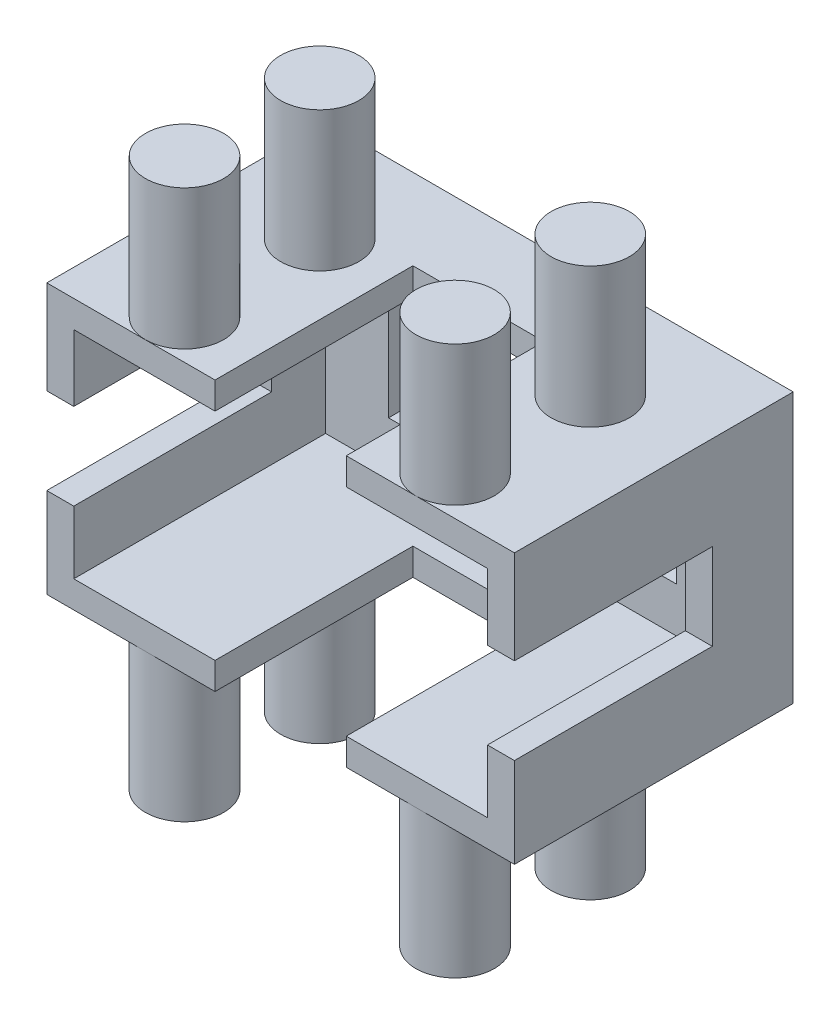
ISO-10303-21;
HEADER;
FILE_DESCRIPTION(('STEP AP214'),'2;1');
FILE_NAME('part.step','',(''),(''),'','','');
FILE_SCHEMA(('AUTOMOTIVE_DESIGN { 1 0 10303 214 1 1 1 1 }'));
ENDSEC;
DATA;
#1=APPLICATION_CONTEXT('core data for automotive mechanical design processes');
#2=APPLICATION_PROTOCOL_DEFINITION('international standard','automotive_design',2000,#1);
#3=PRODUCT_CONTEXT('',#1,'mechanical');
#4=PRODUCT('Part','Part','',(#3));
#5=PRODUCT_RELATED_PRODUCT_CATEGORY('part','',(#4));
#6=PRODUCT_DEFINITION_FORMATION('','',#4);
#7=PRODUCT_DEFINITION_CONTEXT('part definition',#1,'design');
#8=PRODUCT_DEFINITION('design','',#6,#7);
#9=PRODUCT_DEFINITION_SHAPE('','',#8);
#10=(LENGTH_UNIT() NAMED_UNIT(*) SI_UNIT(.MILLI.,.METRE.));
#11=(NAMED_UNIT(*) PLANE_ANGLE_UNIT() SI_UNIT($,.RADIAN.));
#12=(NAMED_UNIT(*) SI_UNIT($,.STERADIAN.) SOLID_ANGLE_UNIT());
#13=UNCERTAINTY_MEASURE_WITH_UNIT(LENGTH_MEASURE(1.E-05),#10,'distance_accuracy_value','');
#14=(GEOMETRIC_REPRESENTATION_CONTEXT(3) GLOBAL_UNCERTAINTY_ASSIGNED_CONTEXT((#13)) GLOBAL_UNIT_ASSIGNED_CONTEXT((#10,
#11,#12)) REPRESENTATION_CONTEXT('',''));
#15=CARTESIAN_POINT('',(0.,0.,0.));
#16=DIRECTION('',(0.,0.,1.));
#17=DIRECTION('',(1.,0.,0.));
#18=AXIS2_PLACEMENT_3D('',#15,#16,#17);
#19=CARTESIAN_POINT('',(1000.,15.,15.5));
#20=DIRECTION('',(0.,0.,-1.));
#21=DIRECTION('',(-1.,0.,0.));
#22=AXIS2_PLACEMENT_3D('',#19,#20,#21);
#23=PLANE('',#22);
#24=DIRECTION('',(1.,0.,0.));
#25=VECTOR('',#24,1.);
#26=CARTESIAN_POINT('',(1.5,1.5,15.5));
#27=LINE('',#26,#25);
#28=CARTESIAN_POINT('',(16.6499579733994,1.5,15.5));
#29=VERTEX_POINT('',#28);
#30=CARTESIAN_POINT('',(24.5,1.5,15.5));
#31=VERTEX_POINT('',#30);
#32=EDGE_CURVE('E359',#29,#31,#27,.T.);
#33=ORIENTED_EDGE('',*,*,#32,.F.);
#34=DIRECTION('',(0.,1.,0.));
#35=VECTOR('',#34,1.);
#36=CARTESIAN_POINT('',(16.6499579733994,-35.,15.5));
#37=LINE('',#36,#35);
#38=CARTESIAN_POINT('',(16.6499579733994,0.,15.5));
#39=VERTEX_POINT('',#38);
#40=EDGE_CURVE('E249',#39,#29,#37,.T.);
#41=ORIENTED_EDGE('',*,*,#40,.F.);
#42=DIRECTION('',(-1.,0.,0.));
#43=VECTOR('',#42,1.);
#44=CARTESIAN_POINT('',(1000.,0.,15.5));
#45=LINE('',#44,#43);
#46=CARTESIAN_POINT('',(20.52,0.,15.5));
#47=VERTEX_POINT('',#46);
#48=EDGE_CURVE('E335',#47,#39,#45,.T.);
#49=ORIENTED_EDGE('',*,*,#48,.F.);
#50=CARTESIAN_POINT('',(26.,0.,15.5));
#51=VERTEX_POINT('',#50);
#52=EDGE_CURVE('E338',#51,#47,#45,.T.);
#53=ORIENTED_EDGE('',*,*,#52,.F.);
#54=DIRECTION('',(0.,-1.,0.));
#55=VECTOR('',#54,1.);
#56=CARTESIAN_POINT('',(26.,0.,15.5));
#57=LINE('',#56,#55);
#58=CARTESIAN_POINT('',(26.,5.,15.5));
#59=VERTEX_POINT('',#58);
#60=EDGE_CURVE('E347',#59,#51,#57,.T.);
#61=ORIENTED_EDGE('',*,*,#60,.F.);
#62=DIRECTION('',(1.,0.,0.));
#63=VECTOR('',#62,1.);
#64=CARTESIAN_POINT('',(1000.,5.,15.5));
#65=LINE('',#64,#63);
#66=CARTESIAN_POINT('',(24.5,5.,15.5));
#67=VERTEX_POINT('',#66);
#68=EDGE_CURVE('E346',#67,#59,#65,.T.);
#69=ORIENTED_EDGE('',*,*,#68,.F.);
#70=DIRECTION('',(0.,1.,0.));
#71=VECTOR('',#70,1.);
#72=CARTESIAN_POINT('',(24.5,1.5,15.5));
#73=LINE('',#72,#71);
#74=EDGE_CURVE('E343',#31,#67,#73,.T.);
#75=ORIENTED_EDGE('',*,*,#74,.F.);
#76=EDGE_LOOP('',(#33,#41,#49,#53,#61,#69,#75));
#77=FACE_BOUND('',#76,.T.);
#78=ADVANCED_FACE('F33',(#77),#23,.F.);
#79=DIRECTION('',(-1.,0.,0.));
#80=VECTOR('',#79,1.);
#81=CARTESIAN_POINT('',(1000.,15.,15.5));
#82=LINE('',#81,#80);
#83=CARTESIAN_POINT('',(26.,15.,15.5));
#84=VERTEX_POINT('',#83);
#85=CARTESIAN_POINT('',(16.6499579733994,15.,15.5));
#86=VERTEX_POINT('',#85);
#87=EDGE_CURVE('E331',#84,#86,#82,.T.);
#88=ORIENTED_EDGE('',*,*,#87,.T.);
#89=DIRECTION('',(0.,-1.,0.));
#90=VECTOR('',#89,1.);
#91=CARTESIAN_POINT('',(16.6499579733994,15.,15.5));
#92=LINE('',#91,#90);
#93=CARTESIAN_POINT('',(16.6499579733994,13.5,15.5));
#94=VERTEX_POINT('',#93);
#95=EDGE_CURVE('E41',#86,#94,#92,.T.);
#96=ORIENTED_EDGE('',*,*,#95,.T.);
#97=DIRECTION('',(-1.,0.,0.));
#98=VECTOR('',#97,1.);
#99=CARTESIAN_POINT('',(1.5,13.5,15.5));
#100=LINE('',#99,#98);
#101=CARTESIAN_POINT('',(24.5,13.5,15.5));
#102=VERTEX_POINT('',#101);
#103=EDGE_CURVE('E348',#102,#94,#100,.T.);
#104=ORIENTED_EDGE('',*,*,#103,.F.);
#105=CARTESIAN_POINT('',(24.5,9.8,15.5));
#106=VERTEX_POINT('',#105);
#107=EDGE_CURVE('E333',#106,#102,#73,.T.);
#108=ORIENTED_EDGE('',*,*,#107,.F.);
#109=DIRECTION('',(-1.,0.,0.));
#110=VECTOR('',#109,1.);
#111=CARTESIAN_POINT('',(1000.,9.8,15.5));
#112=LINE('',#111,#110);
#113=CARTESIAN_POINT('',(26.,9.8,15.5));
#114=VERTEX_POINT('',#113);
#115=EDGE_CURVE('E327',#114,#106,#112,.T.);
#116=ORIENTED_EDGE('',*,*,#115,.F.);
#117=EDGE_CURVE('E342',#84,#114,#57,.T.);
#118=ORIENTED_EDGE('',*,*,#117,.F.);
#119=EDGE_LOOP('',(#88,#96,#104,#108,#116,#118));
#120=FACE_BOUND('',#119,.T.);
#121=ADVANCED_FACE('F486',(#120),#23,.F.);
#122=CARTESIAN_POINT('',(0.,0.,17.4));
#123=DIRECTION('',(1.,0.,0.));
#124=DIRECTION('',(0.,1.,0.));
#125=AXIS2_PLACEMENT_3D('',#122,#123,#124);
#126=PLANE('',#125);
#127=DIRECTION('',(0.,0.,-1.));
#128=VECTOR('',#127,1.);
#129=CARTESIAN_POINT('',(0.,0.,17.4));
#130=LINE('',#129,#128);
#131=CARTESIAN_POINT('',(0.,0.,15.5));
#132=VERTEX_POINT('',#131);
#133=CARTESIAN_POINT('',(0.,0.,0.));
#134=VERTEX_POINT('',#133);
#135=EDGE_CURVE('E461',#132,#134,#130,.T.);
#136=ORIENTED_EDGE('',*,*,#135,.F.);
#137=DIRECTION('',(0.,-1.,0.));
#138=VECTOR('',#137,1.);
#139=CARTESIAN_POINT('',(0.,15.,15.5));
#140=LINE('',#139,#138);
#141=CARTESIAN_POINT('',(0.,5.,15.5));
#142=VERTEX_POINT('',#141);
#143=EDGE_CURVE('E324',#142,#132,#140,.T.);
#144=ORIENTED_EDGE('',*,*,#143,.F.);
#145=DIRECTION('',(0.,0.,1.));
#146=VECTOR('',#145,1.);
#147=CARTESIAN_POINT('',(0.,5.,17.4));
#148=LINE('',#147,#146);
#149=CARTESIAN_POINT('',(0.,5.,4.5));
#150=VERTEX_POINT('',#149);
#151=EDGE_CURVE('E393',#150,#142,#148,.T.);
#152=ORIENTED_EDGE('',*,*,#151,.F.);
#153=DIRECTION('',(0.,-1.,0.));
#154=VECTOR('',#153,1.);
#155=CARTESIAN_POINT('',(0.,9.8,4.5));
#156=LINE('',#155,#154);
#157=CARTESIAN_POINT('',(0.,9.8,4.5));
#158=VERTEX_POINT('',#157);
#159=EDGE_CURVE('E390',#158,#150,#156,.T.);
#160=ORIENTED_EDGE('',*,*,#159,.F.);
#161=DIRECTION('',(0.,0.,-1.));
#162=VECTOR('',#161,1.);
#163=CARTESIAN_POINT('',(0.,9.8,17.4));
#164=LINE('',#163,#162);
#165=CARTESIAN_POINT('',(0.,9.8,15.5));
#166=VERTEX_POINT('',#165);
#167=EDGE_CURVE('E382',#166,#158,#164,.T.);
#168=ORIENTED_EDGE('',*,*,#167,.F.);
#169=CARTESIAN_POINT('',(0.,15.,15.5));
#170=VERTEX_POINT('',#169);
#171=EDGE_CURVE('E328',#170,#166,#140,.T.);
#172=ORIENTED_EDGE('',*,*,#171,.F.);
#173=DIRECTION('',(0.,0.,-1.));
#174=VECTOR('',#173,1.);
#175=CARTESIAN_POINT('',(0.,15.,17.4));
#176=LINE('',#175,#174);
#177=CARTESIAN_POINT('',(0.,15.,0.));
#178=VERTEX_POINT('',#177);
#179=EDGE_CURVE('E455',#170,#178,#176,.T.);
#180=ORIENTED_EDGE('',*,*,#179,.T.);
#181=DIRECTION('',(0.,-1.,0.));
#182=VECTOR('',#181,1.);
#183=CARTESIAN_POINT('',(0.,0.,0.));
#184=LINE('',#183,#182);
#185=EDGE_CURVE('E435',#178,#134,#184,.T.);
#186=ORIENTED_EDGE('',*,*,#185,.T.);
#187=EDGE_LOOP('',(#136,#144,#152,#160,#168,#172,#180,#186));
#188=FACE_BOUND('',#187,.T.);
#189=ADVANCED_FACE('F35',(#188),#126,.F.);
#190=CARTESIAN_POINT('',(0.,0.,17.4));
#191=DIRECTION('',(0.,1.,0.));
#192=DIRECTION('',(0.,0.,1.));
#193=AXIS2_PLACEMENT_3D('',#190,#191,#192);
#194=PLANE('',#193);
#195=ORIENTED_EDGE('',*,*,#48,.T.);
#196=DIRECTION('',(0.,0.,-1.));
#197=VECTOR('',#196,1.);
#198=CARTESIAN_POINT('',(16.6499579733994,0.,17.4));
#199=LINE('',#198,#197);
#200=CARTESIAN_POINT('',(16.6499579733994,0.,4.5));
#201=VERTEX_POINT('',#200);
#202=EDGE_CURVE('E268',#39,#201,#199,.T.);
#203=ORIENTED_EDGE('',*,*,#202,.T.);
#204=DIRECTION('',(-1.,0.,0.));
#205=VECTOR('',#204,1.);
#206=CARTESIAN_POINT('',(0.,0.,4.5));
#207=LINE('',#206,#205);
#208=CARTESIAN_POINT('',(9.35499999999998,0.,4.5));
#209=VERTEX_POINT('',#208);
#210=EDGE_CURVE('E274',#201,#209,#207,.T.);
#211=ORIENTED_EDGE('',*,*,#210,.T.);
#212=DIRECTION('',(0.,0.,1.));
#213=VECTOR('',#212,1.);
#214=CARTESIAN_POINT('',(9.35499999999998,0.,17.4));
#215=LINE('',#214,#213);
#216=CARTESIAN_POINT('',(9.35499999999998,0.,15.5));
#217=VERTEX_POINT('',#216);
#218=EDGE_CURVE('E260',#209,#217,#215,.T.);
#219=ORIENTED_EDGE('',*,*,#218,.T.);
#220=CARTESIAN_POINT('',(5.48,0.,15.5));
#221=VERTEX_POINT('',#220);
#222=EDGE_CURVE('E339',#217,#221,#45,.T.);
#223=ORIENTED_EDGE('',*,*,#222,.T.);
#224=CARTESIAN_POINT('',(5.48,0.,13.32));
#225=DIRECTION('',(0.,-1.,0.));
#226=DIRECTION('',(0.,0.,-1.));
#227=AXIS2_PLACEMENT_3D('',#224,#225,#226);
#228=CIRCLE('',#227,2.18);
#229=EDGE_CURVE('E277',#221,#221,#228,.T.);
#230=ORIENTED_EDGE('',*,*,#229,.F.);
#231=EDGE_CURVE('E330',#221,#132,#45,.T.);
#232=ORIENTED_EDGE('',*,*,#231,.T.);
#233=ORIENTED_EDGE('',*,*,#135,.T.);
#234=DIRECTION('',(1.,0.,0.));
#235=VECTOR('',#234,1.);
#236=CARTESIAN_POINT('',(0.,0.,0.));
#237=LINE('',#236,#235);
#238=CARTESIAN_POINT('',(26.,0.,0.));
#239=VERTEX_POINT('',#238);
#240=EDGE_CURVE('E446',#134,#239,#237,.T.);
#241=ORIENTED_EDGE('',*,*,#240,.T.);
#242=DIRECTION('',(0.,0.,-1.));
#243=VECTOR('',#242,1.);
#244=CARTESIAN_POINT('',(26.,0.,17.4));
#245=LINE('',#244,#243);
#246=EDGE_CURVE('E459',#51,#239,#245,.T.);
#247=ORIENTED_EDGE('',*,*,#246,.F.);
#248=ORIENTED_EDGE('',*,*,#52,.T.);
#249=CARTESIAN_POINT('',(20.52,0.,13.32));
#250=DIRECTION('',(0.,-1.,0.));
#251=DIRECTION('',(0.,0.,1.));
#252=AXIS2_PLACEMENT_3D('',#249,#250,#251);
#253=CIRCLE('',#252,2.18);
#254=EDGE_CURVE('E281',#47,#47,#253,.T.);
#255=ORIENTED_EDGE('',*,*,#254,.F.);
#256=EDGE_LOOP('',(#195,#203,#211,#219,#223,#230,#232,#233,#241,#247,#248,#255));
#257=FACE_BOUND('',#256,.T.);
#258=CARTESIAN_POINT('',(5.48,0.,5.805));
#259=DIRECTION('',(0.,-1.,0.));
#260=DIRECTION('',(0.,0.,-1.));
#261=AXIS2_PLACEMENT_3D('',#258,#259,#260);
#262=CIRCLE('',#261,2.175);
#263=CARTESIAN_POINT('',(5.48,0.,3.63));
#264=VERTEX_POINT('',#263);
#265=EDGE_CURVE('E299',#264,#264,#262,.T.);
#266=ORIENTED_EDGE('',*,*,#265,.F.);
#267=EDGE_LOOP('',(#266));
#268=FACE_BOUND('',#267,.T.);
#269=CARTESIAN_POINT('',(20.52,0.,5.805));
#270=DIRECTION('',(0.,-1.,0.));
#271=DIRECTION('',(0.,0.,1.));
#272=AXIS2_PLACEMENT_3D('',#269,#270,#271);
#273=CIRCLE('',#272,2.175);
#274=CARTESIAN_POINT('',(20.52,0.,7.98));
#275=VERTEX_POINT('',#274);
#276=EDGE_CURVE('E287',#275,#275,#273,.T.);
#277=ORIENTED_EDGE('',*,*,#276,.F.);
#278=EDGE_LOOP('',(#277));
#279=FACE_BOUND('',#278,.T.);
#280=ADVANCED_FACE('F515',(#257,#268,#279),#194,.F.);
#281=CARTESIAN_POINT('',(26.,0.,17.4));
#282=DIRECTION('',(-1.,0.,0.));
#283=DIRECTION('',(0.,-1.,0.));
#284=AXIS2_PLACEMENT_3D('',#281,#282,#283);
#285=PLANE('',#284);
#286=DIRECTION('',(0.,0.,-1.));
#287=VECTOR('',#286,1.);
#288=CARTESIAN_POINT('',(26.,15.,17.4));
#289=LINE('',#288,#287);
#290=CARTESIAN_POINT('',(26.,15.,0.));
#291=VERTEX_POINT('',#290);
#292=EDGE_CURVE('E457',#84,#291,#289,.T.);
#293=ORIENTED_EDGE('',*,*,#292,.F.);
#294=ORIENTED_EDGE('',*,*,#117,.T.);
#295=DIRECTION('',(0.,0.,-1.));
#296=VECTOR('',#295,1.);
#297=CARTESIAN_POINT('',(26.,9.8,17.4));
#298=LINE('',#297,#296);
#299=CARTESIAN_POINT('',(26.,9.8,4.5));
#300=VERTEX_POINT('',#299);
#301=EDGE_CURVE('E406',#114,#300,#298,.T.);
#302=ORIENTED_EDGE('',*,*,#301,.T.);
#303=DIRECTION('',(0.,-1.,0.));
#304=VECTOR('',#303,1.);
#305=CARTESIAN_POINT('',(26.,0.,4.5));
#306=LINE('',#305,#304);
#307=CARTESIAN_POINT('',(26.,5.,4.5));
#308=VERTEX_POINT('',#307);
#309=EDGE_CURVE('E411',#300,#308,#306,.T.);
#310=ORIENTED_EDGE('',*,*,#309,.T.);
#311=DIRECTION('',(0.,0.,1.));
#312=VECTOR('',#311,1.);
#313=CARTESIAN_POINT('',(26.,5.,17.4));
#314=LINE('',#313,#312);
#315=EDGE_CURVE('E416',#308,#59,#314,.T.);
#316=ORIENTED_EDGE('',*,*,#315,.T.);
#317=ORIENTED_EDGE('',*,*,#60,.T.);
#318=ORIENTED_EDGE('',*,*,#246,.T.);
#319=DIRECTION('',(0.,1.,0.));
#320=VECTOR('',#319,1.);
#321=CARTESIAN_POINT('',(26.,0.,0.));
#322=LINE('',#321,#320);
#323=EDGE_CURVE('E449',#239,#291,#322,.T.);
#324=ORIENTED_EDGE('',*,*,#323,.T.);
#325=EDGE_LOOP('',(#293,#294,#302,#310,#316,#317,#318,#324));
#326=FACE_BOUND('',#325,.T.);
#327=ADVANCED_FACE('F501',(#326),#285,.F.);
#328=CARTESIAN_POINT('',(0.,15.,17.4));
#329=DIRECTION('',(0.,-1.,0.));
#330=DIRECTION('',(0.,0.,-1.));
#331=AXIS2_PLACEMENT_3D('',#328,#329,#330);
#332=PLANE('',#331);
#333=CARTESIAN_POINT('',(20.52,15.,5.805));
#334=DIRECTION('',(0.,1.,0.));
#335=DIRECTION('',(0.,0.,1.));
#336=AXIS2_PLACEMENT_3D('',#333,#334,#335);
#337=CIRCLE('',#336,2.175);
#338=CARTESIAN_POINT('',(20.52,15.,7.98));
#339=VERTEX_POINT('',#338);
#340=EDGE_CURVE('E303',#339,#339,#337,.T.);
#341=ORIENTED_EDGE('',*,*,#340,.F.);
#342=EDGE_LOOP('',(#341));
#343=FACE_BOUND('',#342,.T.);
#344=DIRECTION('',(-1.,0.,0.));
#345=VECTOR('',#344,1.);
#346=CARTESIAN_POINT('',(16.6499579733994,15.,4.5));
#347=LINE('',#346,#345);
#348=CARTESIAN_POINT('',(16.6499579733994,15.,4.5));
#349=VERTEX_POINT('',#348);
#350=CARTESIAN_POINT('',(9.35499999999998,15.,4.5));
#351=VERTEX_POINT('',#350);
#352=EDGE_CURVE('E230',#349,#351,#347,.T.);
#353=ORIENTED_EDGE('',*,*,#352,.F.);
#354=DIRECTION('',(0.,0.,-1.));
#355=VECTOR('',#354,1.);
#356=CARTESIAN_POINT('',(16.6499579733994,15.,4.5));
#357=LINE('',#356,#355);
#358=EDGE_CURVE('E236',#86,#349,#357,.T.);
#359=ORIENTED_EDGE('',*,*,#358,.F.);
#360=ORIENTED_EDGE('',*,*,#87,.F.);
#361=ORIENTED_EDGE('',*,*,#292,.T.);
#362=DIRECTION('',(-1.,0.,0.));
#363=VECTOR('',#362,1.);
#364=CARTESIAN_POINT('',(0.,15.,0.));
#365=LINE('',#364,#363);
#366=EDGE_CURVE('E452',#291,#178,#365,.T.);
#367=ORIENTED_EDGE('',*,*,#366,.T.);
#368=ORIENTED_EDGE('',*,*,#179,.F.);
#369=CARTESIAN_POINT('',(9.355,15.,15.5));
#370=VERTEX_POINT('',#369);
#371=EDGE_CURVE('E334',#370,#170,#82,.T.);
#372=ORIENTED_EDGE('',*,*,#371,.F.);
#373=DIRECTION('',(0.,0.,1.));
#374=VECTOR('',#373,1.);
#375=CARTESIAN_POINT('',(9.35499999999998,15.,4.5));
#376=LINE('',#375,#374);
#377=EDGE_CURVE('E56',#351,#370,#376,.T.);
#378=ORIENTED_EDGE('',*,*,#377,.F.);
#379=EDGE_LOOP('',(#353,#359,#360,#361,#367,#368,#372,#378));
#380=FACE_BOUND('',#379,.T.);
#381=CARTESIAN_POINT('',(20.52,15.,13.32));
#382=DIRECTION('',(0.,1.,0.));
#383=DIRECTION('',(0.,0.,1.));
#384=AXIS2_PLACEMENT_3D('',#381,#382,#383);
#385=CIRCLE('',#384,2.17500000000001);
#386=CARTESIAN_POINT('',(20.52,15.,15.495));
#387=VERTEX_POINT('',#386);
#388=EDGE_CURVE('E298',#387,#387,#385,.T.);
#389=ORIENTED_EDGE('',*,*,#388,.F.);
#390=EDGE_LOOP('',(#389));
#391=FACE_BOUND('',#390,.T.);
#392=CARTESIAN_POINT('',(5.47999999999998,15.,5.805));
#393=DIRECTION('',(0.,1.,0.));
#394=DIRECTION('',(0.,0.,-1.));
#395=AXIS2_PLACEMENT_3D('',#392,#393,#394);
#396=CIRCLE('',#395,2.175);
#397=CARTESIAN_POINT('',(5.47999999999998,15.,3.62999999999999));
#398=VERTEX_POINT('',#397);
#399=EDGE_CURVE('E313',#398,#398,#396,.T.);
#400=ORIENTED_EDGE('',*,*,#399,.F.);
#401=EDGE_LOOP('',(#400));
#402=FACE_BOUND('',#401,.T.);
#403=CARTESIAN_POINT('',(5.47999999999997,15.,13.32));
#404=DIRECTION('',(0.,1.,0.));
#405=DIRECTION('',(0.,0.,-1.));
#406=AXIS2_PLACEMENT_3D('',#403,#404,#405);
#407=CIRCLE('',#406,2.17500000000001);
#408=CARTESIAN_POINT('',(5.47999999999997,15.,11.145));
#409=VERTEX_POINT('',#408);
#410=EDGE_CURVE('E307',#409,#409,#407,.T.);
#411=ORIENTED_EDGE('',*,*,#410,.F.);
#412=EDGE_LOOP('',(#411));
#413=FACE_BOUND('',#412,.T.);
#414=ADVANCED_FACE('F243',(#343,#380,#391,#402,#413),#332,.F.);
#415=CARTESIAN_POINT('',(0.,0.,0.));
#416=DIRECTION('',(0.,0.,-1.));
#417=DIRECTION('',(-1.,0.,0.));
#418=AXIS2_PLACEMENT_3D('',#415,#416,#417);
#419=PLANE('',#418);
#420=DIRECTION('',(0.,-1.,0.));
#421=VECTOR('',#420,1.);
#422=CARTESIAN_POINT('',(21.,10.8,0.));
#423=LINE('',#422,#421);
#424=CARTESIAN_POINT('',(21.,10.8,0.));
#425=VERTEX_POINT('',#424);
#426=CARTESIAN_POINT('',(21.,4.,0.));
#427=VERTEX_POINT('',#426);
#428=EDGE_CURVE('E351',#425,#427,#423,.T.);
#429=ORIENTED_EDGE('',*,*,#428,.F.);
#430=DIRECTION('',(1.,0.,0.));
#431=VECTOR('',#430,1.);
#432=CARTESIAN_POINT('',(21.,10.8,0.));
#433=LINE('',#432,#431);
#434=CARTESIAN_POINT('',(5.,10.8,0.));
#435=VERTEX_POINT('',#434);
#436=EDGE_CURVE('E376',#435,#425,#433,.T.);
#437=ORIENTED_EDGE('',*,*,#436,.F.);
#438=DIRECTION('',(0.,1.,0.));
#439=VECTOR('',#438,1.);
#440=CARTESIAN_POINT('',(5.,10.8,0.));
#441=LINE('',#440,#439);
#442=CARTESIAN_POINT('',(5.,4.,0.));
#443=VERTEX_POINT('',#442);
#444=EDGE_CURVE('E373',#443,#435,#441,.T.);
#445=ORIENTED_EDGE('',*,*,#444,.F.);
#446=DIRECTION('',(-1.,0.,0.));
#447=VECTOR('',#446,1.);
#448=CARTESIAN_POINT('',(21.,4.,0.));
#449=LINE('',#448,#447);
#450=EDGE_CURVE('E370',#427,#443,#449,.T.);
#451=ORIENTED_EDGE('',*,*,#450,.F.);
#452=EDGE_LOOP('',(#429,#437,#445,#451));
#453=FACE_BOUND('',#452,.T.);
#454=ORIENTED_EDGE('',*,*,#185,.F.);
#455=ORIENTED_EDGE('',*,*,#366,.F.);
#456=ORIENTED_EDGE('',*,*,#323,.F.);
#457=ORIENTED_EDGE('',*,*,#240,.F.);
#458=EDGE_LOOP('',(#454,#455,#456,#457));
#459=FACE_BOUND('',#458,.T.);
#460=ADVANCED_FACE('F524',(#453,#459),#419,.T.);
#461=CARTESIAN_POINT('',(24.5,1.5,1.5));
#462=DIRECTION('',(1.,0.,0.));
#463=DIRECTION('',(0.,0.,-1.));
#464=AXIS2_PLACEMENT_3D('',#461,#462,#463);
#465=PLANE('',#464);
#466=DIRECTION('',(0.,0.,1.));
#467=VECTOR('',#466,1.);
#468=CARTESIAN_POINT('',(24.5,1.5,1.5));
#469=LINE('',#468,#467);
#470=CARTESIAN_POINT('',(24.5,1.5,1.5));
#471=VERTEX_POINT('',#470);
#472=EDGE_CURVE('E432',#471,#31,#469,.T.);
#473=ORIENTED_EDGE('',*,*,#472,.T.);
#474=ORIENTED_EDGE('',*,*,#74,.T.);
#475=DIRECTION('',(0.,0.,-1.));
#476=VECTOR('',#475,1.);
#477=CARTESIAN_POINT('',(24.5,5.,1.5));
#478=LINE('',#477,#476);
#479=CARTESIAN_POINT('',(24.5,5.,4.5));
#480=VERTEX_POINT('',#479);
#481=EDGE_CURVE('E414',#67,#480,#478,.T.);
#482=ORIENTED_EDGE('',*,*,#481,.T.);
#483=DIRECTION('',(0.,1.,0.));
#484=VECTOR('',#483,1.);
#485=CARTESIAN_POINT('',(24.5,1.5,4.5));
#486=LINE('',#485,#484);
#487=CARTESIAN_POINT('',(24.5,9.8,4.5));
#488=VERTEX_POINT('',#487);
#489=EDGE_CURVE('E408',#480,#488,#486,.T.);
#490=ORIENTED_EDGE('',*,*,#489,.T.);
#491=DIRECTION('',(0.,0.,1.));
#492=VECTOR('',#491,1.);
#493=CARTESIAN_POINT('',(24.5,9.8,1.5));
#494=LINE('',#493,#492);
#495=EDGE_CURVE('E403',#488,#106,#494,.T.);
#496=ORIENTED_EDGE('',*,*,#495,.T.);
#497=ORIENTED_EDGE('',*,*,#107,.T.);
#498=DIRECTION('',(0.,0.,1.));
#499=VECTOR('',#498,1.);
#500=CARTESIAN_POINT('',(24.5,13.5,1.5));
#501=LINE('',#500,#499);
#502=CARTESIAN_POINT('',(24.5,13.5,1.5));
#503=VERTEX_POINT('',#502);
#504=EDGE_CURVE('E431',#503,#102,#501,.T.);
#505=ORIENTED_EDGE('',*,*,#504,.F.);
#506=DIRECTION('',(0.,1.,0.));
#507=VECTOR('',#506,1.);
#508=CARTESIAN_POINT('',(24.5,1.5,1.5));
#509=LINE('',#508,#507);
#510=EDGE_CURVE('E419',#471,#503,#509,.T.);
#511=ORIENTED_EDGE('',*,*,#510,.F.);
#512=EDGE_LOOP('',(#473,#474,#482,#490,#496,#497,#505,#511));
#513=FACE_BOUND('',#512,.T.);
#514=ADVANCED_FACE('F492',(#513),#465,.F.);
#515=CARTESIAN_POINT('',(1.5,1.5,1.5));
#516=DIRECTION('',(0.,-1.,0.));
#517=DIRECTION('',(1.,0.,0.));
#518=AXIS2_PLACEMENT_3D('',#515,#516,#517);
#519=PLANE('',#518);
#520=DIRECTION('',(1.,0.,0.));
#521=VECTOR('',#520,1.);
#522=CARTESIAN_POINT('',(1.5,1.5,4.5));
#523=LINE('',#522,#521);
#524=CARTESIAN_POINT('',(9.35499999999998,1.5,4.5));
#525=VERTEX_POINT('',#524);
#526=CARTESIAN_POINT('',(16.6499579733994,1.5,4.5));
#527=VERTEX_POINT('',#526);
#528=EDGE_CURVE('E271',#525,#527,#523,.T.);
#529=ORIENTED_EDGE('',*,*,#528,.T.);
#530=DIRECTION('',(0.,0.,1.));
#531=VECTOR('',#530,1.);
#532=CARTESIAN_POINT('',(16.6499579733994,1.5,1.5));
#533=LINE('',#532,#531);
#534=EDGE_CURVE('E265',#527,#29,#533,.T.);
#535=ORIENTED_EDGE('',*,*,#534,.T.);
#536=ORIENTED_EDGE('',*,*,#32,.T.);
#537=ORIENTED_EDGE('',*,*,#472,.F.);
#538=DIRECTION('',(1.,0.,0.));
#539=VECTOR('',#538,1.);
#540=CARTESIAN_POINT('',(1.5,1.5,1.5));
#541=LINE('',#540,#539);
#542=CARTESIAN_POINT('',(1.5,1.5,1.5));
#543=VERTEX_POINT('',#542);
#544=EDGE_CURVE('E428',#543,#471,#541,.T.);
#545=ORIENTED_EDGE('',*,*,#544,.F.);
#546=DIRECTION('',(0.,0.,1.));
#547=VECTOR('',#546,1.);
#548=CARTESIAN_POINT('',(1.5,1.5,1.5));
#549=LINE('',#548,#547);
#550=CARTESIAN_POINT('',(1.5,1.5,15.5));
#551=VERTEX_POINT('',#550);
#552=EDGE_CURVE('E436',#543,#551,#549,.T.);
#553=ORIENTED_EDGE('',*,*,#552,.T.);
#554=CARTESIAN_POINT('',(9.355,1.5,15.5));
#555=VERTEX_POINT('',#554);
#556=EDGE_CURVE('E355',#551,#555,#27,.T.);
#557=ORIENTED_EDGE('',*,*,#556,.T.);
#558=DIRECTION('',(0.,0.,-1.));
#559=VECTOR('',#558,1.);
#560=CARTESIAN_POINT('',(9.35499999999998,1.5,1.5));
#561=LINE('',#560,#559);
#562=EDGE_CURVE('E48',#555,#525,#561,.T.);
#563=ORIENTED_EDGE('',*,*,#562,.T.);
#564=EDGE_LOOP('',(#529,#535,#536,#537,#545,#553,#557,#563));
#565=FACE_BOUND('',#564,.T.);
#566=ADVANCED_FACE('F663',(#565),#519,.F.);
#567=CARTESIAN_POINT('',(1.5,1.5,1.5));
#568=DIRECTION('',(-1.,0.,0.));
#569=DIRECTION('',(0.,-1.,0.));
#570=AXIS2_PLACEMENT_3D('',#567,#568,#569);
#571=PLANE('',#570);
#572=DIRECTION('',(0.,0.,1.));
#573=VECTOR('',#572,1.);
#574=CARTESIAN_POINT('',(1.5,13.5,1.5));
#575=LINE('',#574,#573);
#576=CARTESIAN_POINT('',(1.5,13.5,1.5));
#577=VERTEX_POINT('',#576);
#578=CARTESIAN_POINT('',(1.5,13.5,15.5));
#579=VERTEX_POINT('',#578);
#580=EDGE_CURVE('E439',#577,#579,#575,.T.);
#581=ORIENTED_EDGE('',*,*,#580,.T.);
#582=DIRECTION('',(0.,-1.,0.));
#583=VECTOR('',#582,1.);
#584=CARTESIAN_POINT('',(1.5,1.5,15.5));
#585=LINE('',#584,#583);
#586=CARTESIAN_POINT('',(1.49999999999995,9.8,15.5));
#587=VERTEX_POINT('',#586);
#588=EDGE_CURVE('E366',#579,#587,#585,.T.);
#589=ORIENTED_EDGE('',*,*,#588,.T.);
#590=DIRECTION('',(0.,0.,-1.));
#591=VECTOR('',#590,1.);
#592=CARTESIAN_POINT('',(1.5,9.8,1.5));
#593=LINE('',#592,#591);
#594=CARTESIAN_POINT('',(1.5,9.8,4.5));
#595=VERTEX_POINT('',#594);
#596=EDGE_CURVE('E463',#587,#595,#593,.T.);
#597=ORIENTED_EDGE('',*,*,#596,.T.);
#598=DIRECTION('',(0.,-1.,0.));
#599=VECTOR('',#598,1.);
#600=CARTESIAN_POINT('',(1.5,1.5,4.5));
#601=LINE('',#600,#599);
#602=CARTESIAN_POINT('',(1.49999999999995,5.,4.5));
#603=VERTEX_POINT('',#602);
#604=EDGE_CURVE('E465',#595,#603,#601,.T.);
#605=ORIENTED_EDGE('',*,*,#604,.T.);
#606=DIRECTION('',(0.,0.,1.));
#607=VECTOR('',#606,1.);
#608=CARTESIAN_POINT('',(1.5,5.,1.5));
#609=LINE('',#608,#607);
#610=CARTESIAN_POINT('',(1.5,5.,15.5));
#611=VERTEX_POINT('',#610);
#612=EDGE_CURVE('E468',#603,#611,#609,.T.);
#613=ORIENTED_EDGE('',*,*,#612,.T.);
#614=EDGE_CURVE('E363',#611,#551,#585,.T.);
#615=ORIENTED_EDGE('',*,*,#614,.T.);
#616=ORIENTED_EDGE('',*,*,#552,.F.);
#617=DIRECTION('',(0.,-1.,0.));
#618=VECTOR('',#617,1.);
#619=CARTESIAN_POINT('',(1.5,1.5,1.5));
#620=LINE('',#619,#618);
#621=EDGE_CURVE('E425',#577,#543,#620,.T.);
#622=ORIENTED_EDGE('',*,*,#621,.F.);
#623=EDGE_LOOP('',(#581,#589,#597,#605,#613,#615,#616,#622));
#624=FACE_BOUND('',#623,.T.);
#625=ADVANCED_FACE('F542',(#624),#571,.F.);
#626=CARTESIAN_POINT('',(1.5,13.5,1.5));
#627=DIRECTION('',(0.,1.,0.));
#628=DIRECTION('',(0.,0.,1.));
#629=AXIS2_PLACEMENT_3D('',#626,#627,#628);
#630=PLANE('',#629);
#631=ORIENTED_EDGE('',*,*,#103,.T.);
#632=DIRECTION('',(0.,0.,-1.));
#633=VECTOR('',#632,1.);
#634=CARTESIAN_POINT('',(16.6499579733994,13.5,1.5));
#635=LINE('',#634,#633);
#636=CARTESIAN_POINT('',(16.6499579733994,13.5,4.5));
#637=VERTEX_POINT('',#636);
#638=EDGE_CURVE('E263',#94,#637,#635,.T.);
#639=ORIENTED_EDGE('',*,*,#638,.T.);
#640=DIRECTION('',(-1.,0.,0.));
#641=VECTOR('',#640,1.);
#642=CARTESIAN_POINT('',(1.5,13.5,4.5));
#643=LINE('',#642,#641);
#644=CARTESIAN_POINT('',(9.35499999999998,13.5,4.5));
#645=VERTEX_POINT('',#644);
#646=EDGE_CURVE('E11',#637,#645,#643,.T.);
#647=ORIENTED_EDGE('',*,*,#646,.T.);
#648=DIRECTION('',(0.,0.,1.));
#649=VECTOR('',#648,1.);
#650=CARTESIAN_POINT('',(9.35499999999998,13.5,1.5));
#651=LINE('',#650,#649);
#652=CARTESIAN_POINT('',(9.35499999999998,13.5,15.5));
#653=VERTEX_POINT('',#652);
#654=EDGE_CURVE('E251',#645,#653,#651,.T.);
#655=ORIENTED_EDGE('',*,*,#654,.T.);
#656=EDGE_CURVE('E352',#653,#579,#100,.T.);
#657=ORIENTED_EDGE('',*,*,#656,.T.);
#658=ORIENTED_EDGE('',*,*,#580,.F.);
#659=DIRECTION('',(-1.,0.,0.));
#660=VECTOR('',#659,1.);
#661=CARTESIAN_POINT('',(1.5,13.5,1.5));
#662=LINE('',#661,#660);
#663=EDGE_CURVE('E422',#503,#577,#662,.T.);
#664=ORIENTED_EDGE('',*,*,#663,.F.);
#665=ORIENTED_EDGE('',*,*,#504,.T.);
#666=EDGE_LOOP('',(#631,#639,#647,#655,#657,#658,#664,#665));
#667=FACE_BOUND('',#666,.T.);
#668=ADVANCED_FACE('F488',(#667),#630,.F.);
#669=CARTESIAN_POINT('',(0.,0.,1.5));
#670=DIRECTION('',(0.,0.,-1.));
#671=DIRECTION('',(-1.,0.,0.));
#672=AXIS2_PLACEMENT_3D('',#669,#670,#671);
#673=PLANE('',#672);
#674=DIRECTION('',(1.,0.,0.));
#675=VECTOR('',#674,1.);
#676=CARTESIAN_POINT('',(0.,10.8,1.5));
#677=LINE('',#676,#675);
#678=CARTESIAN_POINT('',(5.,10.8,1.49999999999995));
#679=VERTEX_POINT('',#678);
#680=CARTESIAN_POINT('',(21.,10.8,1.49999999999995));
#681=VERTEX_POINT('',#680);
#682=EDGE_CURVE('E477',#679,#681,#677,.T.);
#683=ORIENTED_EDGE('',*,*,#682,.T.);
#684=DIRECTION('',(0.,-1.,0.));
#685=VECTOR('',#684,1.);
#686=CARTESIAN_POINT('',(21.,0.,1.5));
#687=LINE('',#686,#685);
#688=CARTESIAN_POINT('',(21.,4.,1.49999999999995));
#689=VERTEX_POINT('',#688);
#690=EDGE_CURVE('E480',#681,#689,#687,.T.);
#691=ORIENTED_EDGE('',*,*,#690,.T.);
#692=DIRECTION('',(-1.,0.,0.));
#693=VECTOR('',#692,1.);
#694=CARTESIAN_POINT('',(0.,4.,1.5));
#695=LINE('',#694,#693);
#696=CARTESIAN_POINT('',(5.,4.,1.5));
#697=VERTEX_POINT('',#696);
#698=EDGE_CURVE('E471',#689,#697,#695,.T.);
#699=ORIENTED_EDGE('',*,*,#698,.T.);
#700=DIRECTION('',(0.,1.,0.));
#701=VECTOR('',#700,1.);
#702=CARTESIAN_POINT('',(5.,0.,1.5));
#703=LINE('',#702,#701);
#704=EDGE_CURVE('E474',#697,#679,#703,.T.);
#705=ORIENTED_EDGE('',*,*,#704,.T.);
#706=EDGE_LOOP('',(#683,#691,#699,#705));
#707=FACE_BOUND('',#706,.T.);
#708=ORIENTED_EDGE('',*,*,#510,.T.);
#709=ORIENTED_EDGE('',*,*,#663,.T.);
#710=ORIENTED_EDGE('',*,*,#621,.T.);
#711=ORIENTED_EDGE('',*,*,#544,.T.);
#712=EDGE_LOOP('',(#708,#709,#710,#711));
#713=FACE_BOUND('',#712,.T.);
#714=ADVANCED_FACE('F563',(#707,#713),#673,.F.);
#715=CARTESIAN_POINT('',(1000.,9.8,17.4));
#716=DIRECTION('',(0.,1.,0.));
#717=DIRECTION('',(0.,0.,1.));
#718=AXIS2_PLACEMENT_3D('',#715,#716,#717);
#719=PLANE('',#718);
#720=ORIENTED_EDGE('',*,*,#596,.F.);
#721=DIRECTION('',(-1.,0.,0.));
#722=VECTOR('',#721,1.);
#723=CARTESIAN_POINT('',(1000.,9.8,15.5));
#724=LINE('',#723,#722);
#725=EDGE_CURVE('E358',#587,#166,#724,.T.);
#726=ORIENTED_EDGE('',*,*,#725,.T.);
#727=ORIENTED_EDGE('',*,*,#167,.T.);
#728=DIRECTION('',(-1.,0.,0.));
#729=VECTOR('',#728,1.);
#730=CARTESIAN_POINT('',(1000.,9.8,4.5));
#731=LINE('',#730,#729);
#732=EDGE_CURVE('E396',#595,#158,#731,.T.);
#733=ORIENTED_EDGE('',*,*,#732,.F.);
#734=EDGE_LOOP('',(#720,#726,#727,#733));
#735=FACE_BOUND('',#734,.T.);
#736=ADVANCED_FACE('F538',(#735),#719,.F.);
#737=CARTESIAN_POINT('',(1000.,9.8,4.5));
#738=DIRECTION('',(0.,0.,-1.));
#739=DIRECTION('',(-1.,0.,0.));
#740=AXIS2_PLACEMENT_3D('',#737,#738,#739);
#741=PLANE('',#740);
#742=ORIENTED_EDGE('',*,*,#732,.T.);
#743=ORIENTED_EDGE('',*,*,#159,.T.);
#744=DIRECTION('',(-1.,0.,0.));
#745=VECTOR('',#744,1.);
#746=CARTESIAN_POINT('',(1000.,5.,4.5));
#747=LINE('',#746,#745);
#748=EDGE_CURVE('E397',#603,#150,#747,.T.);
#749=ORIENTED_EDGE('',*,*,#748,.F.);
#750=ORIENTED_EDGE('',*,*,#604,.F.);
#751=EDGE_LOOP('',(#742,#743,#749,#750));
#752=FACE_BOUND('',#751,.T.);
#753=ADVANCED_FACE('F555',(#752),#741,.F.);
#754=CARTESIAN_POINT('',(1000.,5.,17.4));
#755=DIRECTION('',(0.,-1.,0.));
#756=DIRECTION('',(0.,0.,-1.));
#757=AXIS2_PLACEMENT_3D('',#754,#755,#756);
#758=PLANE('',#757);
#759=ORIENTED_EDGE('',*,*,#151,.T.);
#760=DIRECTION('',(1.,0.,0.));
#761=VECTOR('',#760,1.);
#762=CARTESIAN_POINT('',(1000.,5.,15.5));
#763=LINE('',#762,#761);
#764=EDGE_CURVE('E360',#142,#611,#763,.T.);
#765=ORIENTED_EDGE('',*,*,#764,.T.);
#766=ORIENTED_EDGE('',*,*,#612,.F.);
#767=ORIENTED_EDGE('',*,*,#748,.T.);
#768=EDGE_LOOP('',(#759,#765,#766,#767));
#769=FACE_BOUND('',#768,.T.);
#770=ADVANCED_FACE('F552',(#769),#758,.F.);
#771=ORIENTED_EDGE('',*,*,#481,.F.);
#772=ORIENTED_EDGE('',*,*,#68,.T.);
#773=ORIENTED_EDGE('',*,*,#315,.F.);
#774=EDGE_CURVE('E399',#308,#480,#747,.T.);
#775=ORIENTED_EDGE('',*,*,#774,.T.);
#776=EDGE_LOOP('',(#771,#772,#773,#775));
#777=FACE_BOUND('',#776,.T.);
#778=ADVANCED_FACE('F509',(#777),#758,.F.);
#779=EDGE_CURVE('E400',#300,#488,#731,.T.);
#780=ORIENTED_EDGE('',*,*,#779,.T.);
#781=ORIENTED_EDGE('',*,*,#489,.F.);
#782=ORIENTED_EDGE('',*,*,#774,.F.);
#783=ORIENTED_EDGE('',*,*,#309,.F.);
#784=EDGE_LOOP('',(#780,#781,#782,#783));
#785=FACE_BOUND('',#784,.T.);
#786=ADVANCED_FACE('F504',(#785),#741,.F.);
#787=ORIENTED_EDGE('',*,*,#301,.F.);
#788=ORIENTED_EDGE('',*,*,#115,.T.);
#789=ORIENTED_EDGE('',*,*,#495,.F.);
#790=ORIENTED_EDGE('',*,*,#779,.F.);
#791=EDGE_LOOP('',(#787,#788,#789,#790));
#792=FACE_BOUND('',#791,.T.);
#793=ADVANCED_FACE('F495',(#792),#719,.F.);
#794=CARTESIAN_POINT('',(21.,10.8,1000.));
#795=DIRECTION('',(1.,0.,0.));
#796=DIRECTION('',(0.,0.,-1.));
#797=AXIS2_PLACEMENT_3D('',#794,#795,#796);
#798=PLANE('',#797);
#799=DIRECTION('',(0.,0.,-1.));
#800=VECTOR('',#799,1.);
#801=CARTESIAN_POINT('',(21.,10.8,1000.));
#802=LINE('',#801,#800);
#803=EDGE_CURVE('E380',#681,#425,#802,.T.);
#804=ORIENTED_EDGE('',*,*,#803,.T.);
#805=ORIENTED_EDGE('',*,*,#428,.T.);
#806=DIRECTION('',(0.,0.,-1.));
#807=VECTOR('',#806,1.);
#808=CARTESIAN_POINT('',(21.,4.,1000.));
#809=LINE('',#808,#807);
#810=EDGE_CURVE('E379',#689,#427,#809,.T.);
#811=ORIENTED_EDGE('',*,*,#810,.F.);
#812=ORIENTED_EDGE('',*,*,#690,.F.);
#813=EDGE_LOOP('',(#804,#805,#811,#812));
#814=FACE_BOUND('',#813,.T.);
#815=ADVANCED_FACE('F596',(#814),#798,.F.);
#816=CARTESIAN_POINT('',(21.,10.8,1000.));
#817=DIRECTION('',(0.,1.,0.));
#818=DIRECTION('',(0.,0.,1.));
#819=AXIS2_PLACEMENT_3D('',#816,#817,#818);
#820=PLANE('',#819);
#821=DIRECTION('',(0.,0.,-1.));
#822=VECTOR('',#821,1.);
#823=CARTESIAN_POINT('',(5.,10.8,1000.));
#824=LINE('',#823,#822);
#825=EDGE_CURVE('E383',#679,#435,#824,.T.);
#826=ORIENTED_EDGE('',*,*,#825,.T.);
#827=ORIENTED_EDGE('',*,*,#436,.T.);
#828=ORIENTED_EDGE('',*,*,#803,.F.);
#829=ORIENTED_EDGE('',*,*,#682,.F.);
#830=EDGE_LOOP('',(#826,#827,#828,#829));
#831=FACE_BOUND('',#830,.T.);
#832=ADVANCED_FACE('F592',(#831),#820,.F.);
#833=CARTESIAN_POINT('',(5.,10.8,1000.));
#834=DIRECTION('',(-1.,0.,0.));
#835=DIRECTION('',(0.,0.,1.));
#836=AXIS2_PLACEMENT_3D('',#833,#834,#835);
#837=PLANE('',#836);
#838=DIRECTION('',(0.,0.,-1.));
#839=VECTOR('',#838,1.);
#840=CARTESIAN_POINT('',(5.,4.,1000.));
#841=LINE('',#840,#839);
#842=EDGE_CURVE('E385',#697,#443,#841,.T.);
#843=ORIENTED_EDGE('',*,*,#842,.T.);
#844=ORIENTED_EDGE('',*,*,#444,.T.);
#845=ORIENTED_EDGE('',*,*,#825,.F.);
#846=ORIENTED_EDGE('',*,*,#704,.F.);
#847=EDGE_LOOP('',(#843,#844,#845,#846));
#848=FACE_BOUND('',#847,.T.);
#849=ADVANCED_FACE('F586',(#848),#837,.F.);
#850=CARTESIAN_POINT('',(21.,4.,1000.));
#851=DIRECTION('',(0.,-1.,0.));
#852=DIRECTION('',(0.,0.,-1.));
#853=AXIS2_PLACEMENT_3D('',#850,#851,#852);
#854=PLANE('',#853);
#855=ORIENTED_EDGE('',*,*,#810,.T.);
#856=ORIENTED_EDGE('',*,*,#450,.T.);
#857=ORIENTED_EDGE('',*,*,#842,.F.);
#858=ORIENTED_EDGE('',*,*,#698,.F.);
#859=EDGE_LOOP('',(#855,#856,#857,#858));
#860=FACE_BOUND('',#859,.T.);
#861=ADVANCED_FACE('F582',(#860),#854,.F.);
#862=ORIENTED_EDGE('',*,*,#222,.F.);
#863=DIRECTION('',(0.,1.,0.));
#864=VECTOR('',#863,1.);
#865=CARTESIAN_POINT('',(9.35499999999998,-35.,15.5));
#866=LINE('',#865,#864);
#867=EDGE_CURVE('E252',#217,#555,#866,.T.);
#868=ORIENTED_EDGE('',*,*,#867,.T.);
#869=ORIENTED_EDGE('',*,*,#556,.F.);
#870=ORIENTED_EDGE('',*,*,#614,.F.);
#871=ORIENTED_EDGE('',*,*,#764,.F.);
#872=ORIENTED_EDGE('',*,*,#143,.T.);
#873=ORIENTED_EDGE('',*,*,#231,.F.);
#874=EDGE_LOOP('',(#862,#868,#869,#870,#871,#872,#873));
#875=FACE_BOUND('',#874,.T.);
#876=ADVANCED_FACE('F549',(#875),#23,.F.);
#877=ORIENTED_EDGE('',*,*,#656,.F.);
#878=DIRECTION('',(0.,1.,0.));
#879=VECTOR('',#878,1.);
#880=CARTESIAN_POINT('',(9.355,15.,15.5));
#881=LINE('',#880,#879);
#882=EDGE_CURVE('E302',#653,#370,#881,.T.);
#883=ORIENTED_EDGE('',*,*,#882,.T.);
#884=ORIENTED_EDGE('',*,*,#371,.T.);
#885=ORIENTED_EDGE('',*,*,#171,.T.);
#886=ORIENTED_EDGE('',*,*,#725,.F.);
#887=ORIENTED_EDGE('',*,*,#588,.F.);
#888=EDGE_LOOP('',(#877,#883,#884,#885,#886,#887));
#889=FACE_BOUND('',#888,.T.);
#890=ADVANCED_FACE('F533',(#889),#23,.F.);
#891=CARTESIAN_POINT('',(20.52,22.76,5.805));
#892=DIRECTION('',(0.,-1.,0.));
#893=DIRECTION('',(0.,0.,-1.));
#894=AXIS2_PLACEMENT_3D('',#891,#892,#893);
#895=CYLINDRICAL_SURFACE('',#894,2.175);
#896=CARTESIAN_POINT('',(20.52,22.76,5.805));
#897=DIRECTION('',(0.,1.,0.));
#898=DIRECTION('',(0.,0.,1.));
#899=AXIS2_PLACEMENT_3D('',#896,#897,#898);
#900=CIRCLE('',#899,2.175);
#901=CARTESIAN_POINT('',(20.52,22.76,7.98));
#902=VERTEX_POINT('',#901);
#903=EDGE_CURVE('E319',#902,#902,#900,.T.);
#904=ORIENTED_EDGE('',*,*,#903,.F.);
#905=EDGE_LOOP('',(#904));
#906=FACE_BOUND('',#905,.T.);
#907=ORIENTED_EDGE('',*,*,#340,.T.);
#908=EDGE_LOOP('',(#907));
#909=FACE_BOUND('',#908,.T.);
#910=ADVANCED_FACE('F575',(#906,#909),#895,.T.);
#911=CARTESIAN_POINT('',(20.52,22.76,5.805));
#912=DIRECTION('',(0.,1.,0.));
#913=DIRECTION('',(0.,0.,1.));
#914=AXIS2_PLACEMENT_3D('',#911,#912,#913);
#915=PLANE('',#914);
#916=ORIENTED_EDGE('',*,*,#903,.T.);
#917=EDGE_LOOP('',(#916));
#918=FACE_BOUND('',#917,.T.);
#919=ADVANCED_FACE('F580',(#918),#915,.T.);
#920=CARTESIAN_POINT('',(5.47999999999998,22.76,5.805));
#921=DIRECTION('',(0.,-1.,0.));
#922=DIRECTION('',(0.,0.,-1.));
#923=AXIS2_PLACEMENT_3D('',#920,#921,#922);
#924=CYLINDRICAL_SURFACE('',#923,2.175);
#925=CARTESIAN_POINT('',(5.47999999999998,22.76,5.805));
#926=DIRECTION('',(0.,1.,0.));
#927=DIRECTION('',(0.,0.,-1.));
#928=AXIS2_PLACEMENT_3D('',#925,#926,#927);
#929=CIRCLE('',#928,2.175);
#930=CARTESIAN_POINT('',(5.47999999999998,22.76,3.62999999999999));
#931=VERTEX_POINT('',#930);
#932=EDGE_CURVE('E316',#931,#931,#929,.T.);
#933=ORIENTED_EDGE('',*,*,#932,.F.);
#934=EDGE_LOOP('',(#933));
#935=FACE_BOUND('',#934,.T.);
#936=ORIENTED_EDGE('',*,*,#399,.T.);
#937=EDGE_LOOP('',(#936));
#938=FACE_BOUND('',#937,.T.);
#939=ADVANCED_FACE('F838',(#935,#938),#924,.T.);
#940=CARTESIAN_POINT('',(5.47999999999998,22.76,5.805));
#941=DIRECTION('',(0.,-1.,0.));
#942=DIRECTION('',(0.,0.,-1.));
#943=AXIS2_PLACEMENT_3D('',#940,#941,#942);
#944=PLANE('',#943);
#945=ORIENTED_EDGE('',*,*,#932,.T.);
#946=EDGE_LOOP('',(#945));
#947=FACE_BOUND('',#946,.T.);
#948=ADVANCED_FACE('F834',(#947),#944,.F.);
#949=CARTESIAN_POINT('',(5.47999999999997,22.76,13.32));
#950=DIRECTION('',(0.,-1.,0.));
#951=DIRECTION('',(0.,0.,-1.));
#952=AXIS2_PLACEMENT_3D('',#949,#950,#951);
#953=CYLINDRICAL_SURFACE('',#952,2.17500000000001);
#954=CARTESIAN_POINT('',(5.47999999999997,22.76,13.32));
#955=DIRECTION('',(0.,1.,0.));
#956=DIRECTION('',(0.,0.,-1.));
#957=AXIS2_PLACEMENT_3D('',#954,#955,#956);
#958=CIRCLE('',#957,2.17500000000001);
#959=CARTESIAN_POINT('',(5.47999999999997,22.76,11.145));
#960=VERTEX_POINT('',#959);
#961=EDGE_CURVE('E310',#960,#960,#958,.T.);
#962=ORIENTED_EDGE('',*,*,#961,.F.);
#963=EDGE_LOOP('',(#962));
#964=FACE_BOUND('',#963,.T.);
#965=ORIENTED_EDGE('',*,*,#410,.T.);
#966=EDGE_LOOP('',(#965));
#967=FACE_BOUND('',#966,.T.);
#968=ADVANCED_FACE('F830',(#964,#967),#953,.T.);
#969=CARTESIAN_POINT('',(5.47999999999997,22.76,13.32));
#970=DIRECTION('',(0.,-1.,0.));
#971=DIRECTION('',(0.,0.,-1.));
#972=AXIS2_PLACEMENT_3D('',#969,#970,#971);
#973=PLANE('',#972);
#974=ORIENTED_EDGE('',*,*,#961,.T.);
#975=EDGE_LOOP('',(#974));
#976=FACE_BOUND('',#975,.T.);
#977=ADVANCED_FACE('F826',(#976),#973,.F.);
#978=CARTESIAN_POINT('',(20.52,22.76,13.32));
#979=DIRECTION('',(0.,-1.,0.));
#980=DIRECTION('',(0.,0.,-1.));
#981=AXIS2_PLACEMENT_3D('',#978,#979,#980);
#982=CYLINDRICAL_SURFACE('',#981,2.17500000000001);
#983=CARTESIAN_POINT('',(20.52,22.76,13.32));
#984=DIRECTION('',(0.,1.,0.));
#985=DIRECTION('',(0.,0.,1.));
#986=AXIS2_PLACEMENT_3D('',#983,#984,#985);
#987=CIRCLE('',#986,2.17500000000001);
#988=CARTESIAN_POINT('',(20.52,22.76,15.495));
#989=VERTEX_POINT('',#988);
#990=EDGE_CURVE('E304',#989,#989,#987,.T.);
#991=ORIENTED_EDGE('',*,*,#990,.F.);
#992=EDGE_LOOP('',(#991));
#993=FACE_BOUND('',#992,.T.);
#994=ORIENTED_EDGE('',*,*,#388,.T.);
#995=EDGE_LOOP('',(#994));
#996=FACE_BOUND('',#995,.T.);
#997=ADVANCED_FACE('F822',(#993,#996),#982,.T.);
#998=CARTESIAN_POINT('',(20.52,22.76,13.32));
#999=DIRECTION('',(0.,1.,0.));
#1000=DIRECTION('',(0.,0.,1.));
#1001=AXIS2_PLACEMENT_3D('',#998,#999,#1000);
#1002=PLANE('',#1001);
#1003=ORIENTED_EDGE('',*,*,#990,.T.);
#1004=EDGE_LOOP('',(#1003));
#1005=FACE_BOUND('',#1004,.T.);
#1006=ADVANCED_FACE('F818',(#1005),#1002,.T.);
#1007=CARTESIAN_POINT('',(5.48,-7.76,5.805));
#1008=DIRECTION('',(0.,1.,0.));
#1009=DIRECTION('',(0.,0.,1.));
#1010=AXIS2_PLACEMENT_3D('',#1007,#1008,#1009);
#1011=CYLINDRICAL_SURFACE('',#1010,2.175);
#1012=CARTESIAN_POINT('',(5.48,-7.76,5.805));
#1013=DIRECTION('',(0.,-1.,0.));
#1014=DIRECTION('',(0.,0.,-1.));
#1015=AXIS2_PLACEMENT_3D('',#1012,#1013,#1014);
#1016=CIRCLE('',#1015,2.175);
#1017=CARTESIAN_POINT('',(5.48,-7.76,3.63));
#1018=VERTEX_POINT('',#1017);
#1019=EDGE_CURVE('E293',#1018,#1018,#1016,.T.);
#1020=ORIENTED_EDGE('',*,*,#1019,.F.);
#1021=EDGE_LOOP('',(#1020));
#1022=FACE_BOUND('',#1021,.T.);
#1023=ORIENTED_EDGE('',*,*,#265,.T.);
#1024=EDGE_LOOP('',(#1023));
#1025=FACE_BOUND('',#1024,.T.);
#1026=ADVANCED_FACE('F814',(#1022,#1025),#1011,.T.);
#1027=CARTESIAN_POINT('',(5.48,-7.76,5.805));
#1028=DIRECTION('',(0.,-1.,0.));
#1029=DIRECTION('',(0.,0.,-1.));
#1030=AXIS2_PLACEMENT_3D('',#1027,#1028,#1029);
#1031=PLANE('',#1030);
#1032=ORIENTED_EDGE('',*,*,#1019,.T.);
#1033=EDGE_LOOP('',(#1032));
#1034=FACE_BOUND('',#1033,.T.);
#1035=ADVANCED_FACE('F810',(#1034),#1031,.T.);
#1036=CARTESIAN_POINT('',(20.52,-7.76,5.805));
#1037=DIRECTION('',(0.,1.,0.));
#1038=DIRECTION('',(0.,0.,1.));
#1039=AXIS2_PLACEMENT_3D('',#1036,#1037,#1038);
#1040=CYLINDRICAL_SURFACE('',#1039,2.175);
#1041=CARTESIAN_POINT('',(20.52,-7.76,5.805));
#1042=DIRECTION('',(0.,-1.,0.));
#1043=DIRECTION('',(0.,0.,1.));
#1044=AXIS2_PLACEMENT_3D('',#1041,#1042,#1043);
#1045=CIRCLE('',#1044,2.175);
#1046=CARTESIAN_POINT('',(20.52,-7.76,7.98));
#1047=VERTEX_POINT('',#1046);
#1048=EDGE_CURVE('E290',#1047,#1047,#1045,.T.);
#1049=ORIENTED_EDGE('',*,*,#1048,.F.);
#1050=EDGE_LOOP('',(#1049));
#1051=FACE_BOUND('',#1050,.T.);
#1052=ORIENTED_EDGE('',*,*,#276,.T.);
#1053=EDGE_LOOP('',(#1052));
#1054=FACE_BOUND('',#1053,.T.);
#1055=ADVANCED_FACE('F806',(#1051,#1054),#1040,.T.);
#1056=CARTESIAN_POINT('',(20.52,-7.76,5.805));
#1057=DIRECTION('',(0.,1.,0.));
#1058=DIRECTION('',(0.,0.,1.));
#1059=AXIS2_PLACEMENT_3D('',#1056,#1057,#1058);
#1060=PLANE('',#1059);
#1061=ORIENTED_EDGE('',*,*,#1048,.T.);
#1062=EDGE_LOOP('',(#1061));
#1063=FACE_BOUND('',#1062,.T.);
#1064=ADVANCED_FACE('F802',(#1063),#1060,.F.);
#1065=CARTESIAN_POINT('',(20.52,-7.76,13.32));
#1066=DIRECTION('',(0.,1.,0.));
#1067=DIRECTION('',(0.,0.,1.));
#1068=AXIS2_PLACEMENT_3D('',#1065,#1066,#1067);
#1069=CYLINDRICAL_SURFACE('',#1068,2.18);
#1070=CARTESIAN_POINT('',(20.52,-7.76,13.32));
#1071=DIRECTION('',(0.,-1.,0.));
#1072=DIRECTION('',(0.,0.,1.));
#1073=AXIS2_PLACEMENT_3D('',#1070,#1071,#1072);
#1074=CIRCLE('',#1073,2.18);
#1075=CARTESIAN_POINT('',(20.52,-7.76,15.5));
#1076=VERTEX_POINT('',#1075);
#1077=EDGE_CURVE('E284',#1076,#1076,#1074,.T.);
#1078=ORIENTED_EDGE('',*,*,#1077,.F.);
#1079=EDGE_LOOP('',(#1078));
#1080=FACE_BOUND('',#1079,.T.);
#1081=ORIENTED_EDGE('',*,*,#254,.T.);
#1082=EDGE_LOOP('',(#1081));
#1083=FACE_BOUND('',#1082,.T.);
#1084=ADVANCED_FACE('F798',(#1080,#1083),#1069,.T.);
#1085=CARTESIAN_POINT('',(20.52,-7.76,13.32));
#1086=DIRECTION('',(0.,1.,0.));
#1087=DIRECTION('',(0.,0.,1.));
#1088=AXIS2_PLACEMENT_3D('',#1085,#1086,#1087);
#1089=PLANE('',#1088);
#1090=ORIENTED_EDGE('',*,*,#1077,.T.);
#1091=EDGE_LOOP('',(#1090));
#1092=FACE_BOUND('',#1091,.T.);
#1093=ADVANCED_FACE('F794',(#1092),#1089,.F.);
#1094=CARTESIAN_POINT('',(5.48,-7.76,13.32));
#1095=DIRECTION('',(0.,1.,0.));
#1096=DIRECTION('',(0.,0.,1.));
#1097=AXIS2_PLACEMENT_3D('',#1094,#1095,#1096);
#1098=CYLINDRICAL_SURFACE('',#1097,2.18);
#1099=CARTESIAN_POINT('',(5.48,-7.76,13.32));
#1100=DIRECTION('',(0.,-1.,0.));
#1101=DIRECTION('',(0.,0.,-1.));
#1102=AXIS2_PLACEMENT_3D('',#1099,#1100,#1101);
#1103=CIRCLE('',#1102,2.18);
#1104=CARTESIAN_POINT('',(5.48,-7.76,11.14));
#1105=VERTEX_POINT('',#1104);
#1106=EDGE_CURVE('E278',#1105,#1105,#1103,.T.);
#1107=ORIENTED_EDGE('',*,*,#1106,.F.);
#1108=EDGE_LOOP('',(#1107));
#1109=FACE_BOUND('',#1108,.T.);
#1110=ORIENTED_EDGE('',*,*,#229,.T.);
#1111=EDGE_LOOP('',(#1110));
#1112=FACE_BOUND('',#1111,.T.);
#1113=ADVANCED_FACE('F790',(#1109,#1112),#1098,.T.);
#1114=CARTESIAN_POINT('',(5.48,-7.76,13.32));
#1115=DIRECTION('',(0.,-1.,0.));
#1116=DIRECTION('',(0.,0.,-1.));
#1117=AXIS2_PLACEMENT_3D('',#1114,#1115,#1116);
#1118=PLANE('',#1117);
#1119=ORIENTED_EDGE('',*,*,#1106,.T.);
#1120=EDGE_LOOP('',(#1119));
#1121=FACE_BOUND('',#1120,.T.);
#1122=ADVANCED_FACE('F740',(#1121),#1118,.T.);
#1123=CARTESIAN_POINT('',(9.35499999999998,-35.,4.5));
#1124=DIRECTION('',(-1.,0.,0.));
#1125=DIRECTION('',(0.,0.,1.));
#1126=AXIS2_PLACEMENT_3D('',#1123,#1124,#1125);
#1127=PLANE('',#1126);
#1128=DIRECTION('',(0.,1.,0.));
#1129=VECTOR('',#1128,1.);
#1130=CARTESIAN_POINT('',(9.35499999999998,-35.,4.5));
#1131=LINE('',#1130,#1129);
#1132=EDGE_CURVE('E255',#645,#351,#1131,.T.);
#1133=ORIENTED_EDGE('',*,*,#1132,.T.);
#1134=ORIENTED_EDGE('',*,*,#377,.T.);
#1135=ORIENTED_EDGE('',*,*,#882,.F.);
#1136=ORIENTED_EDGE('',*,*,#654,.F.);
#1137=EDGE_LOOP('',(#1133,#1134,#1135,#1136));
#1138=FACE_BOUND('',#1137,.T.);
#1139=ADVANCED_FACE('F735',(#1138),#1127,.F.);
#1140=CARTESIAN_POINT('',(16.6499579733994,-35.,4.5));
#1141=DIRECTION('',(1.,0.,0.));
#1142=DIRECTION('',(0.,0.,-1.));
#1143=AXIS2_PLACEMENT_3D('',#1140,#1141,#1142);
#1144=PLANE('',#1143);
#1145=ORIENTED_EDGE('',*,*,#95,.F.);
#1146=ORIENTED_EDGE('',*,*,#358,.T.);
#1147=DIRECTION('',(0.,1.,0.));
#1148=VECTOR('',#1147,1.);
#1149=CARTESIAN_POINT('',(16.6499579733994,-35.,4.5));
#1150=LINE('',#1149,#1148);
#1151=EDGE_CURVE('E225',#637,#349,#1150,.T.);
#1152=ORIENTED_EDGE('',*,*,#1151,.F.);
#1153=ORIENTED_EDGE('',*,*,#638,.F.);
#1154=EDGE_LOOP('',(#1145,#1146,#1152,#1153));
#1155=FACE_BOUND('',#1154,.T.);
#1156=ADVANCED_FACE('F237',(#1155),#1144,.F.);
#1157=CARTESIAN_POINT('',(16.6499579733994,-35.,4.5));
#1158=DIRECTION('',(0.,0.,-1.));
#1159=DIRECTION('',(-1.,0.,0.));
#1160=AXIS2_PLACEMENT_3D('',#1157,#1158,#1159);
#1161=PLANE('',#1160);
#1162=ORIENTED_EDGE('',*,*,#1151,.T.);
#1163=ORIENTED_EDGE('',*,*,#352,.T.);
#1164=ORIENTED_EDGE('',*,*,#1132,.F.);
#1165=ORIENTED_EDGE('',*,*,#646,.F.);
#1166=EDGE_LOOP('',(#1162,#1163,#1164,#1165));
#1167=FACE_BOUND('',#1166,.T.);
#1168=ADVANCED_FACE('F227',(#1167),#1161,.F.);
#1169=EDGE_CURVE('E233',#201,#527,#1150,.T.);
#1170=ORIENTED_EDGE('',*,*,#1169,.T.);
#1171=ORIENTED_EDGE('',*,*,#528,.F.);
#1172=EDGE_CURVE('E254',#209,#525,#1131,.T.);
#1173=ORIENTED_EDGE('',*,*,#1172,.F.);
#1174=ORIENTED_EDGE('',*,*,#210,.F.);
#1175=EDGE_LOOP('',(#1170,#1171,#1173,#1174));
#1176=FACE_BOUND('',#1175,.T.);
#1177=ADVANCED_FACE('F761',(#1176),#1161,.F.);
#1178=ORIENTED_EDGE('',*,*,#40,.T.);
#1179=ORIENTED_EDGE('',*,*,#534,.F.);
#1180=ORIENTED_EDGE('',*,*,#1169,.F.);
#1181=ORIENTED_EDGE('',*,*,#202,.F.);
#1182=EDGE_LOOP('',(#1178,#1179,#1180,#1181));
#1183=FACE_BOUND('',#1182,.T.);
#1184=ADVANCED_FACE('F753',(#1183),#1144,.F.);
#1185=ORIENTED_EDGE('',*,*,#1172,.T.);
#1186=ORIENTED_EDGE('',*,*,#562,.F.);
#1187=ORIENTED_EDGE('',*,*,#867,.F.);
#1188=ORIENTED_EDGE('',*,*,#218,.F.);
#1189=EDGE_LOOP('',(#1185,#1186,#1187,#1188));
#1190=FACE_BOUND('',#1189,.T.);
#1191=ADVANCED_FACE('F742',(#1190),#1127,.F.);
#1192=CLOSED_SHELL('',(#78,#121,#189,#280,#327,#414,#460,#514,#566,#625,#668,#714,#736,#753,
#770,#778,#786,#793,#815,#832,#849,#861,#876,#890,#910,#919,#939,#948,#968,#977,#997,#1006,
#1026,#1035,#1055,#1064,#1084,#1093,#1113,#1122,#1139,#1156,#1168,#1177,#1184,#1191));
#1193=MANIFOLD_SOLID_BREP('B2',#1192);
#1194=ADVANCED_BREP_SHAPE_REPRESENTATION('',(#18,#1193),#14);
#1195=SHAPE_DEFINITION_REPRESENTATION(#9,#1194);
ENDSEC;
END-ISO-10303-21;
